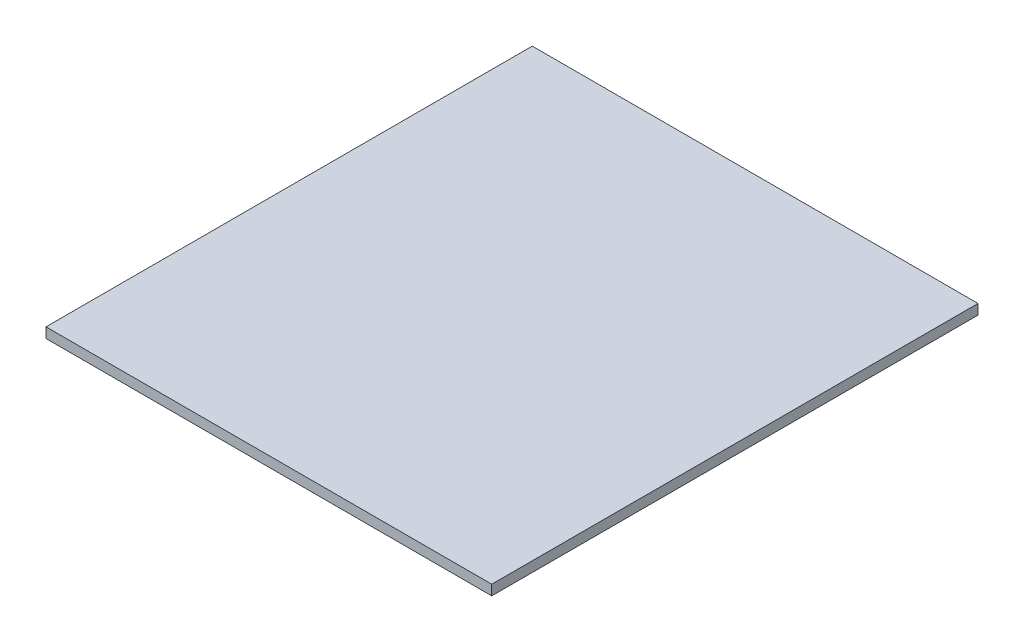
ISO-10303-21;
HEADER;
FILE_DESCRIPTION(('STEP AP214'),'2;1');
FILE_NAME('part.step','',(''),(''),'','','');
FILE_SCHEMA(('AUTOMOTIVE_DESIGN { 1 0 10303 214 1 1 1 1 }'));
ENDSEC;
DATA;
#1=APPLICATION_CONTEXT('core data for automotive mechanical design processes');
#2=APPLICATION_PROTOCOL_DEFINITION('international standard','automotive_design',2000,#1);
#3=PRODUCT_CONTEXT('',#1,'mechanical');
#4=PRODUCT('Part','Part','',(#3));
#5=PRODUCT_RELATED_PRODUCT_CATEGORY('part','',(#4));
#6=PRODUCT_DEFINITION_FORMATION('','',#4);
#7=PRODUCT_DEFINITION_CONTEXT('part definition',#1,'design');
#8=PRODUCT_DEFINITION('design','',#6,#7);
#9=PRODUCT_DEFINITION_SHAPE('','',#8);
#10=(LENGTH_UNIT() NAMED_UNIT(*) SI_UNIT(.MILLI.,.METRE.));
#11=(NAMED_UNIT(*) PLANE_ANGLE_UNIT() SI_UNIT($,.RADIAN.));
#12=(NAMED_UNIT(*) SI_UNIT($,.STERADIAN.) SOLID_ANGLE_UNIT());
#13=UNCERTAINTY_MEASURE_WITH_UNIT(LENGTH_MEASURE(1.E-05),#10,'distance_accuracy_value','');
#14=(GEOMETRIC_REPRESENTATION_CONTEXT(3) GLOBAL_UNCERTAINTY_ASSIGNED_CONTEXT((#13)) GLOBAL_UNIT_ASSIGNED_CONTEXT((#10,
#11,#12)) REPRESENTATION_CONTEXT('',''));
#15=CARTESIAN_POINT('',(0.,0.,0.));
#16=DIRECTION('',(0.,0.,1.));
#17=DIRECTION('',(1.,0.,0.));
#18=AXIS2_PLACEMENT_3D('',#15,#16,#17);
#19=CARTESIAN_POINT('',(139.7,6.35,152.4));
#20=DIRECTION('',(-1.,0.,0.));
#21=DIRECTION('',(0.,0.,1.));
#22=AXIS2_PLACEMENT_3D('',#19,#20,#21);
#23=PLANE('',#22);
#24=DIRECTION('',(0.,0.,-1.));
#25=VECTOR('',#24,1.);
#26=CARTESIAN_POINT('',(139.7,0.,152.4));
#27=LINE('',#26,#25);
#28=CARTESIAN_POINT('',(139.7,0.,152.4));
#29=VERTEX_POINT('',#28);
#30=CARTESIAN_POINT('',(139.7,0.,-152.4));
#31=VERTEX_POINT('',#30);
#32=EDGE_CURVE('E99',#29,#31,#27,.T.);
#33=ORIENTED_EDGE('',*,*,#32,.T.);
#34=DIRECTION('',(0.,-1.,0.));
#35=VECTOR('',#34,1.);
#36=CARTESIAN_POINT('',(139.7,6.35,-152.4));
#37=LINE('',#36,#35);
#38=CARTESIAN_POINT('',(139.7,6.35,-152.4));
#39=VERTEX_POINT('',#38);
#40=EDGE_CURVE('E11',#39,#31,#37,.T.);
#41=ORIENTED_EDGE('',*,*,#40,.F.);
#42=DIRECTION('',(0.,0.,-1.));
#43=VECTOR('',#42,1.);
#44=CARTESIAN_POINT('',(139.7,6.35,152.4));
#45=LINE('',#44,#43);
#46=CARTESIAN_POINT('',(139.7,6.35,152.4));
#47=VERTEX_POINT('',#46);
#48=EDGE_CURVE('E87',#47,#39,#45,.T.);
#49=ORIENTED_EDGE('',*,*,#48,.F.);
#50=DIRECTION('',(0.,-1.,0.));
#51=VECTOR('',#50,1.);
#52=CARTESIAN_POINT('',(139.7,6.35,152.4));
#53=LINE('',#52,#51);
#54=EDGE_CURVE('E95',#47,#29,#53,.T.);
#55=ORIENTED_EDGE('',*,*,#54,.T.);
#56=EDGE_LOOP('',(#33,#41,#49,#55));
#57=FACE_BOUND('',#56,.T.);
#58=ADVANCED_FACE('F36',(#57),#23,.F.);
#59=CARTESIAN_POINT('',(-139.7,6.35,-152.4));
#60=DIRECTION('',(0.,0.,1.));
#61=DIRECTION('',(1.,0.,0.));
#62=AXIS2_PLACEMENT_3D('',#59,#60,#61);
#63=PLANE('',#62);
#64=DIRECTION('',(-1.,0.,0.));
#65=VECTOR('',#64,1.);
#66=CARTESIAN_POINT('',(-139.7,0.,-152.4));
#67=LINE('',#66,#65);
#68=CARTESIAN_POINT('',(-139.7,0.,-152.4));
#69=VERTEX_POINT('',#68);
#70=EDGE_CURVE('E91',#31,#69,#67,.T.);
#71=ORIENTED_EDGE('',*,*,#70,.T.);
#72=DIRECTION('',(0.,-1.,0.));
#73=VECTOR('',#72,1.);
#74=CARTESIAN_POINT('',(-139.7,6.35,-152.4));
#75=LINE('',#74,#73);
#76=CARTESIAN_POINT('',(-139.7,6.35,-152.4));
#77=VERTEX_POINT('',#76);
#78=EDGE_CURVE('E44',#77,#69,#75,.T.);
#79=ORIENTED_EDGE('',*,*,#78,.F.);
#80=DIRECTION('',(-1.,0.,0.));
#81=VECTOR('',#80,1.);
#82=CARTESIAN_POINT('',(-139.7,6.35,-152.4));
#83=LINE('',#82,#81);
#84=EDGE_CURVE('E82',#39,#77,#83,.T.);
#85=ORIENTED_EDGE('',*,*,#84,.F.);
#86=ORIENTED_EDGE('',*,*,#40,.T.);
#87=EDGE_LOOP('',(#71,#79,#85,#86));
#88=FACE_BOUND('',#87,.T.);
#89=ADVANCED_FACE('F90',(#88),#63,.F.);
#90=CARTESIAN_POINT('',(-139.7,6.35,152.4));
#91=DIRECTION('',(1.,0.,0.));
#92=DIRECTION('',(0.,0.,-1.));
#93=AXIS2_PLACEMENT_3D('',#90,#91,#92);
#94=PLANE('',#93);
#95=DIRECTION('',(0.,0.,1.));
#96=VECTOR('',#95,1.);
#97=CARTESIAN_POINT('',(-139.7,0.,152.4));
#98=LINE('',#97,#96);
#99=CARTESIAN_POINT('',(-139.7,0.,152.4));
#100=VERTEX_POINT('',#99);
#101=EDGE_CURVE('E69',#69,#100,#98,.T.);
#102=ORIENTED_EDGE('',*,*,#101,.T.);
#103=DIRECTION('',(0.,-1.,0.));
#104=VECTOR('',#103,1.);
#105=CARTESIAN_POINT('',(-139.7,6.35,152.4));
#106=LINE('',#105,#104);
#107=CARTESIAN_POINT('',(-139.7,6.35,152.4));
#108=VERTEX_POINT('',#107);
#109=EDGE_CURVE('E92',#108,#100,#106,.T.);
#110=ORIENTED_EDGE('',*,*,#109,.F.);
#111=DIRECTION('',(0.,0.,1.));
#112=VECTOR('',#111,1.);
#113=CARTESIAN_POINT('',(-139.7,6.35,152.4));
#114=LINE('',#113,#112);
#115=EDGE_CURVE('E85',#77,#108,#114,.T.);
#116=ORIENTED_EDGE('',*,*,#115,.F.);
#117=ORIENTED_EDGE('',*,*,#78,.T.);
#118=EDGE_LOOP('',(#102,#110,#116,#117));
#119=FACE_BOUND('',#118,.T.);
#120=ADVANCED_FACE('F93',(#119),#94,.F.);
#121=CARTESIAN_POINT('',(-139.7,6.35,152.4));
#122=DIRECTION('',(0.,0.,-1.));
#123=DIRECTION('',(-1.,0.,0.));
#124=AXIS2_PLACEMENT_3D('',#121,#122,#123);
#125=PLANE('',#124);
#126=DIRECTION('',(1.,0.,0.));
#127=VECTOR('',#126,1.);
#128=CARTESIAN_POINT('',(-139.7,0.,152.4));
#129=LINE('',#128,#127);
#130=EDGE_CURVE('E75',#100,#29,#129,.T.);
#131=ORIENTED_EDGE('',*,*,#130,.T.);
#132=ORIENTED_EDGE('',*,*,#54,.F.);
#133=DIRECTION('',(1.,0.,0.));
#134=VECTOR('',#133,1.);
#135=CARTESIAN_POINT('',(-139.7,6.35,152.4));
#136=LINE('',#135,#134);
#137=EDGE_CURVE('E52',#108,#47,#136,.T.);
#138=ORIENTED_EDGE('',*,*,#137,.F.);
#139=ORIENTED_EDGE('',*,*,#109,.T.);
#140=EDGE_LOOP('',(#131,#132,#138,#139));
#141=FACE_BOUND('',#140,.T.);
#142=ADVANCED_FACE('F106',(#141),#125,.F.);
#143=CARTESIAN_POINT('',(0.,6.35,0.));
#144=DIRECTION('',(0.,-1.,0.));
#145=DIRECTION('',(0.,0.,-1.));
#146=AXIS2_PLACEMENT_3D('',#143,#144,#145);
#147=PLANE('',#146);
#148=ORIENTED_EDGE('',*,*,#48,.T.);
#149=ORIENTED_EDGE('',*,*,#84,.T.);
#150=ORIENTED_EDGE('',*,*,#115,.T.);
#151=ORIENTED_EDGE('',*,*,#137,.T.);
#152=EDGE_LOOP('',(#148,#149,#150,#151));
#153=FACE_BOUND('',#152,.T.);
#154=ADVANCED_FACE('F83',(#153),#147,.F.);
#155=CARTESIAN_POINT('',(0.,0.,0.));
#156=DIRECTION('',(0.,-1.,0.));
#157=DIRECTION('',(0.,0.,-1.));
#158=AXIS2_PLACEMENT_3D('',#155,#156,#157);
#159=PLANE('',#158);
#160=ORIENTED_EDGE('',*,*,#32,.F.);
#161=ORIENTED_EDGE('',*,*,#130,.F.);
#162=ORIENTED_EDGE('',*,*,#101,.F.);
#163=ORIENTED_EDGE('',*,*,#70,.F.);
#164=EDGE_LOOP('',(#160,#161,#162,#163));
#165=FACE_BOUND('',#164,.T.);
#166=ADVANCED_FACE('F109',(#165),#159,.T.);
#167=CLOSED_SHELL('',(#58,#89,#120,#142,#154,#166));
#168=MANIFOLD_SOLID_BREP('B2',#167);
#169=ADVANCED_BREP_SHAPE_REPRESENTATION('',(#18,#168),#14);
#170=SHAPE_DEFINITION_REPRESENTATION(#9,#169);
ENDSEC;
END-ISO-10303-21;
